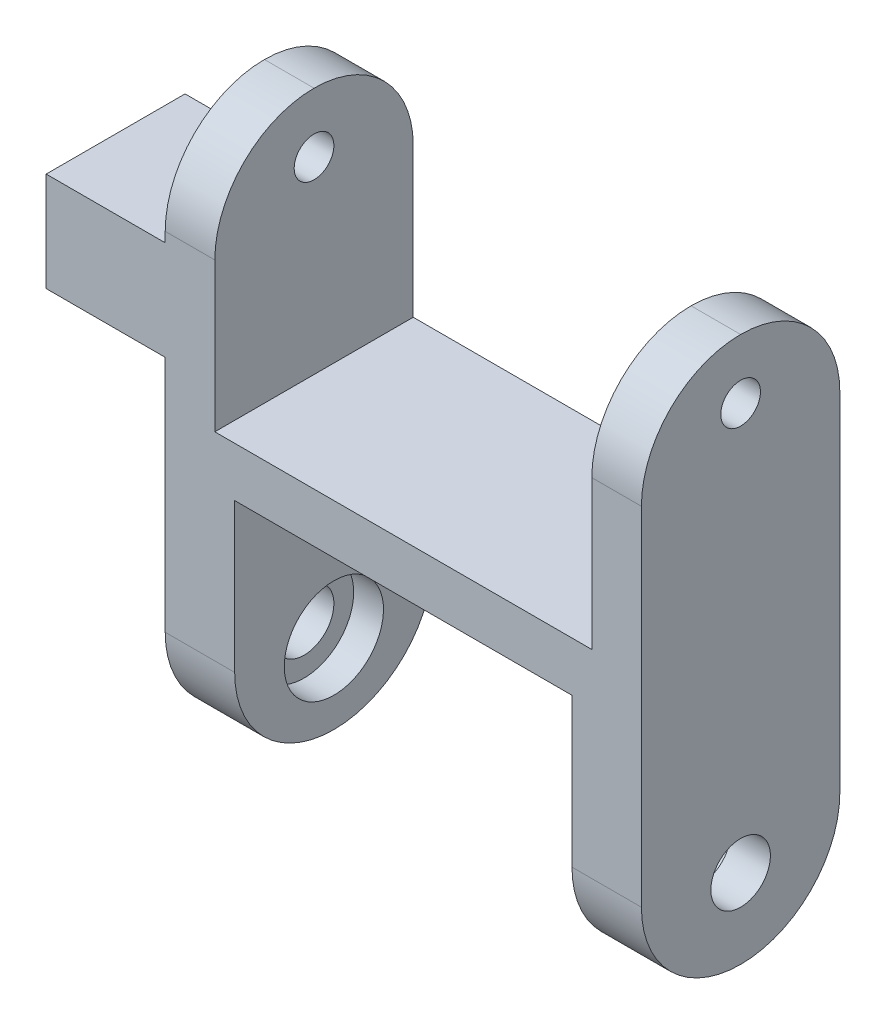
ISO-10303-21;
HEADER;
FILE_DESCRIPTION(('STEP AP214'),'2;1');
FILE_NAME('part.step','',(''),(''),'','','');
FILE_SCHEMA(('AUTOMOTIVE_DESIGN { 1 0 10303 214 1 1 1 1 }'));
ENDSEC;
DATA;
#1=APPLICATION_CONTEXT('core data for automotive mechanical design processes');
#2=APPLICATION_PROTOCOL_DEFINITION('international standard','automotive_design',2000,#1);
#3=PRODUCT_CONTEXT('',#1,'mechanical');
#4=PRODUCT('Part','Part','',(#3));
#5=PRODUCT_RELATED_PRODUCT_CATEGORY('part','',(#4));
#6=PRODUCT_DEFINITION_FORMATION('','',#4);
#7=PRODUCT_DEFINITION_CONTEXT('part definition',#1,'design');
#8=PRODUCT_DEFINITION('design','',#6,#7);
#9=PRODUCT_DEFINITION_SHAPE('','',#8);
#10=(LENGTH_UNIT() NAMED_UNIT(*) SI_UNIT(.MILLI.,.METRE.));
#11=(NAMED_UNIT(*) PLANE_ANGLE_UNIT() SI_UNIT($,.RADIAN.));
#12=(NAMED_UNIT(*) SI_UNIT($,.STERADIAN.) SOLID_ANGLE_UNIT());
#13=UNCERTAINTY_MEASURE_WITH_UNIT(LENGTH_MEASURE(1.E-05),#10,'distance_accuracy_value','');
#14=(GEOMETRIC_REPRESENTATION_CONTEXT(3) GLOBAL_UNCERTAINTY_ASSIGNED_CONTEXT((#13)) GLOBAL_UNIT_ASSIGNED_CONTEXT((#10,
#11,#12)) REPRESENTATION_CONTEXT('',''));
#15=CARTESIAN_POINT('',(0.,0.,0.));
#16=DIRECTION('',(0.,0.,1.));
#17=DIRECTION('',(1.,0.,0.));
#18=AXIS2_PLACEMENT_3D('',#15,#16,#17);
#19=CARTESIAN_POINT('',(-8.5,0.,10.));
#20=DIRECTION('',(-1.,0.,0.));
#21=DIRECTION('',(0.,-1.,0.));
#22=AXIS2_PLACEMENT_3D('',#19,#20,#21);
#23=PLANE('',#22);
#24=CARTESIAN_POINT('',(-8.5,-8.5,5.));
#25=DIRECTION('',(1.,0.,0.));
#26=DIRECTION('',(0.,1.,0.));
#27=AXIS2_PLACEMENT_3D('',#24,#25,#26);
#28=CIRCLE('',#27,2.5);
#29=CARTESIAN_POINT('',(-8.5,-6.,5.));
#30=VERTEX_POINT('',#29);
#31=EDGE_CURVE('E259',#30,#30,#28,.T.);
#32=ORIENTED_EDGE('',*,*,#31,.F.);
#33=EDGE_LOOP('',(#32));
#34=FACE_BOUND('',#33,.T.);
#35=DIRECTION('',(0.,1.,0.));
#36=VECTOR('',#35,1.);
#37=CARTESIAN_POINT('',(-8.5,0.,10.));
#38=LINE('',#37,#36);
#39=CARTESIAN_POINT('',(-8.5,-7.5,10.));
#40=VERTEX_POINT('',#39);
#41=CARTESIAN_POINT('',(-8.5,0.,10.));
#42=VERTEX_POINT('',#41);
#43=EDGE_CURVE('E268',#40,#42,#38,.T.);
#44=ORIENTED_EDGE('',*,*,#43,.F.);
#45=CARTESIAN_POINT('',(-8.5,-7.5,5.));
#46=DIRECTION('',(-1.,0.,0.));
#47=DIRECTION('',(0.,-1.,0.));
#48=AXIS2_PLACEMENT_3D('',#45,#46,#47);
#49=CIRCLE('',#48,5.);
#50=CARTESIAN_POINT('',(-8.5,-12.5,5.));
#51=VERTEX_POINT('',#50);
#52=EDGE_CURVE('E348',#40,#51,#49,.F.);
#53=ORIENTED_EDGE('',*,*,#52,.T.);
#54=CARTESIAN_POINT('',(-8.5,-7.5,5.));
#55=DIRECTION('',(-1.,0.,0.));
#56=DIRECTION('',(0.,-1.,0.));
#57=AXIS2_PLACEMENT_3D('',#54,#55,#56);
#58=CIRCLE('',#57,5.);
#59=CARTESIAN_POINT('',(-8.5,-7.5,0.));
#60=VERTEX_POINT('',#59);
#61=EDGE_CURVE('E346',#51,#60,#58,.F.);
#62=ORIENTED_EDGE('',*,*,#61,.T.);
#63=DIRECTION('',(0.,1.,0.));
#64=VECTOR('',#63,1.);
#65=CARTESIAN_POINT('',(-8.5,0.,0.));
#66=LINE('',#65,#64);
#67=CARTESIAN_POINT('',(-8.5,0.,0.));
#68=VERTEX_POINT('',#67);
#69=EDGE_CURVE('E265',#60,#68,#66,.T.);
#70=ORIENTED_EDGE('',*,*,#69,.T.);
#71=DIRECTION('',(0.,0.,-1.));
#72=VECTOR('',#71,1.);
#73=CARTESIAN_POINT('',(-8.5,0.,10.));
#74=LINE('',#73,#72);
#75=EDGE_CURVE('E315',#42,#68,#74,.T.);
#76=ORIENTED_EDGE('',*,*,#75,.F.);
#77=EDGE_LOOP('',(#44,#53,#62,#70,#76));
#78=FACE_BOUND('',#77,.T.);
#79=ADVANCED_FACE('F33',(#34,#78),#23,.F.);
#80=CARTESIAN_POINT('',(8.5,0.,10.));
#81=DIRECTION('',(0.,1.,0.));
#82=DIRECTION('',(0.,0.,1.));
#83=AXIS2_PLACEMENT_3D('',#80,#81,#82);
#84=PLANE('',#83);
#85=DIRECTION('',(1.,0.,0.));
#86=VECTOR('',#85,1.);
#87=CARTESIAN_POINT('',(8.5,0.,0.));
#88=LINE('',#87,#86);
#89=CARTESIAN_POINT('',(8.5,0.,0.));
#90=VERTEX_POINT('',#89);
#91=EDGE_CURVE('E291',#68,#90,#88,.T.);
#92=ORIENTED_EDGE('',*,*,#91,.T.);
#93=DIRECTION('',(0.,0.,-1.));
#94=VECTOR('',#93,1.);
#95=CARTESIAN_POINT('',(8.5,0.,10.));
#96=LINE('',#95,#94);
#97=CARTESIAN_POINT('',(8.5,0.,10.));
#98=VERTEX_POINT('',#97);
#99=EDGE_CURVE('E312',#98,#90,#96,.T.);
#100=ORIENTED_EDGE('',*,*,#99,.F.);
#101=DIRECTION('',(1.,0.,0.));
#102=VECTOR('',#101,1.);
#103=CARTESIAN_POINT('',(8.5,0.,10.));
#104=LINE('',#103,#102);
#105=EDGE_CURVE('E270',#42,#98,#104,.T.);
#106=ORIENTED_EDGE('',*,*,#105,.F.);
#107=ORIENTED_EDGE('',*,*,#75,.T.);
#108=EDGE_LOOP('',(#92,#100,#106,#107));
#109=FACE_BOUND('',#108,.T.);
#110=ADVANCED_FACE('F464',(#109),#84,.F.);
#111=CARTESIAN_POINT('',(8.5,0.,10.));
#112=DIRECTION('',(1.,0.,0.));
#113=DIRECTION('',(0.,1.,0.));
#114=AXIS2_PLACEMENT_3D('',#111,#112,#113);
#115=PLANE('',#114);
#116=CARTESIAN_POINT('',(8.5,-8.5,5.));
#117=DIRECTION('',(1.,0.,0.));
#118=DIRECTION('',(0.,1.,0.));
#119=AXIS2_PLACEMENT_3D('',#116,#117,#118);
#120=CIRCLE('',#119,2.5);
#121=CARTESIAN_POINT('',(8.5,-5.99999999999999,5.));
#122=VERTEX_POINT('',#121);
#123=EDGE_CURVE('E247',#122,#122,#120,.T.);
#124=ORIENTED_EDGE('',*,*,#123,.T.);
#125=EDGE_LOOP('',(#124));
#126=FACE_BOUND('',#125,.T.);
#127=CARTESIAN_POINT('',(8.5,-7.5,5.));
#128=DIRECTION('',(1.,0.,0.));
#129=DIRECTION('',(0.,1.,0.));
#130=AXIS2_PLACEMENT_3D('',#127,#128,#129);
#131=CIRCLE('',#130,5.);
#132=CARTESIAN_POINT('',(8.5,-7.5,0.));
#133=VERTEX_POINT('',#132);
#134=CARTESIAN_POINT('',(8.5,-12.5,5.));
#135=VERTEX_POINT('',#134);
#136=EDGE_CURVE('E342',#133,#135,#131,.F.);
#137=ORIENTED_EDGE('',*,*,#136,.T.);
#138=CARTESIAN_POINT('',(8.5,-7.5,5.));
#139=DIRECTION('',(1.,0.,0.));
#140=DIRECTION('',(0.,1.,0.));
#141=AXIS2_PLACEMENT_3D('',#138,#139,#140);
#142=CIRCLE('',#141,5.);
#143=CARTESIAN_POINT('',(8.5,-7.5,10.));
#144=VERTEX_POINT('',#143);
#145=EDGE_CURVE('E344',#135,#144,#142,.F.);
#146=ORIENTED_EDGE('',*,*,#145,.T.);
#147=DIRECTION('',(0.,-1.,0.));
#148=VECTOR('',#147,1.);
#149=CARTESIAN_POINT('',(8.5,0.,10.));
#150=LINE('',#149,#148);
#151=EDGE_CURVE('E273',#98,#144,#150,.T.);
#152=ORIENTED_EDGE('',*,*,#151,.F.);
#153=ORIENTED_EDGE('',*,*,#99,.T.);
#154=DIRECTION('',(0.,-1.,0.));
#155=VECTOR('',#154,1.);
#156=CARTESIAN_POINT('',(8.5,0.,0.));
#157=LINE('',#156,#155);
#158=EDGE_CURVE('E293',#90,#133,#157,.T.);
#159=ORIENTED_EDGE('',*,*,#158,.T.);
#160=EDGE_LOOP('',(#137,#146,#152,#153,#159));
#161=FACE_BOUND('',#160,.T.);
#162=ADVANCED_FACE('F470',(#126,#161),#115,.F.);
#163=CARTESIAN_POINT('',(12.,2.5,10.));
#164=DIRECTION('',(-1.,0.,0.));
#165=DIRECTION('',(0.,-1.,0.));
#166=AXIS2_PLACEMENT_3D('',#163,#164,#165);
#167=PLANE('',#166);
#168=CARTESIAN_POINT('',(12.,12.,5.));
#169=DIRECTION('',(-1.,0.,0.));
#170=DIRECTION('',(0.,0.,1.));
#171=AXIS2_PLACEMENT_3D('',#168,#169,#170);
#172=CIRCLE('',#171,1.);
#173=CARTESIAN_POINT('',(12.,12.,6.));
#174=VERTEX_POINT('',#173);
#175=EDGE_CURVE('E232',#174,#174,#172,.T.);
#176=ORIENTED_EDGE('',*,*,#175,.T.);
#177=EDGE_LOOP('',(#176));
#178=FACE_BOUND('',#177,.T.);
#179=CARTESIAN_POINT('',(12.,-8.5,5.));
#180=DIRECTION('',(1.,0.,0.));
#181=DIRECTION('',(0.,1.,0.));
#182=AXIS2_PLACEMENT_3D('',#179,#180,#181);
#183=CIRCLE('',#182,1.5);
#184=CARTESIAN_POINT('',(12.,-7.,5.));
#185=VERTEX_POINT('',#184);
#186=EDGE_CURVE('E244',#185,#185,#183,.T.);
#187=ORIENTED_EDGE('',*,*,#186,.F.);
#188=EDGE_LOOP('',(#187));
#189=FACE_BOUND('',#188,.T.);
#190=DIRECTION('',(0.,1.,0.));
#191=VECTOR('',#190,1.);
#192=CARTESIAN_POINT('',(12.,-12.5,10.));
#193=LINE('',#192,#191);
#194=CARTESIAN_POINT('',(12.,-7.5,10.));
#195=VERTEX_POINT('',#194);
#196=CARTESIAN_POINT('',(12.,10.,10.));
#197=VERTEX_POINT('',#196);
#198=EDGE_CURVE('E276',#195,#197,#193,.T.);
#199=ORIENTED_EDGE('',*,*,#198,.F.);
#200=CARTESIAN_POINT('',(12.,-7.5,5.));
#201=DIRECTION('',(-1.,0.,0.));
#202=DIRECTION('',(0.,-1.,0.));
#203=AXIS2_PLACEMENT_3D('',#200,#201,#202);
#204=CIRCLE('',#203,5.);
#205=CARTESIAN_POINT('',(12.,-12.5,5.));
#206=VERTEX_POINT('',#205);
#207=EDGE_CURVE('E340',#195,#206,#204,.F.);
#208=ORIENTED_EDGE('',*,*,#207,.T.);
#209=CARTESIAN_POINT('',(12.,-7.5,5.));
#210=DIRECTION('',(-1.,0.,0.));
#211=DIRECTION('',(0.,-1.,0.));
#212=AXIS2_PLACEMENT_3D('',#209,#210,#211);
#213=CIRCLE('',#212,5.);
#214=CARTESIAN_POINT('',(12.,-7.5,0.));
#215=VERTEX_POINT('',#214);
#216=EDGE_CURVE('E338',#206,#215,#213,.F.);
#217=ORIENTED_EDGE('',*,*,#216,.T.);
#218=DIRECTION('',(0.,1.,0.));
#219=VECTOR('',#218,1.);
#220=CARTESIAN_POINT('',(12.,2.5,0.));
#221=LINE('',#220,#219);
#222=CARTESIAN_POINT('',(12.,10.,0.));
#223=VERTEX_POINT('',#222);
#224=EDGE_CURVE('E296',#215,#223,#221,.T.);
#225=ORIENTED_EDGE('',*,*,#224,.T.);
#226=CARTESIAN_POINT('',(12.,10.,5.));
#227=DIRECTION('',(-1.,0.,0.));
#228=DIRECTION('',(0.,-1.,0.));
#229=AXIS2_PLACEMENT_3D('',#226,#227,#228);
#230=CIRCLE('',#229,5.);
#231=CARTESIAN_POINT('',(12.,15.,5.));
#232=VERTEX_POINT('',#231);
#233=EDGE_CURVE('E334',#223,#232,#230,.F.);
#234=ORIENTED_EDGE('',*,*,#233,.T.);
#235=CARTESIAN_POINT('',(12.,10.,5.));
#236=DIRECTION('',(-1.,0.,0.));
#237=DIRECTION('',(0.,-1.,0.));
#238=AXIS2_PLACEMENT_3D('',#235,#236,#237);
#239=CIRCLE('',#238,5.);
#240=EDGE_CURVE('E336',#232,#197,#239,.F.);
#241=ORIENTED_EDGE('',*,*,#240,.T.);
#242=EDGE_LOOP('',(#199,#208,#217,#225,#234,#241));
#243=FACE_BOUND('',#242,.T.);
#244=ADVANCED_FACE('F543',(#178,#189,#243),#167,.F.);
#245=CARTESIAN_POINT('',(9.5,15.,10.));
#246=DIRECTION('',(1.,0.,0.));
#247=DIRECTION('',(0.,1.,0.));
#248=AXIS2_PLACEMENT_3D('',#245,#246,#247);
#249=PLANE('',#248);
#250=CARTESIAN_POINT('',(9.5,12.,5.));
#251=DIRECTION('',(1.,0.,0.));
#252=DIRECTION('',(0.,1.,0.));
#253=AXIS2_PLACEMENT_3D('',#250,#251,#252);
#254=CIRCLE('',#253,1.);
#255=CARTESIAN_POINT('',(9.5,13.,5.));
#256=VERTEX_POINT('',#255);
#257=EDGE_CURVE('E240',#256,#256,#254,.T.);
#258=ORIENTED_EDGE('',*,*,#257,.T.);
#259=EDGE_LOOP('',(#258));
#260=FACE_BOUND('',#259,.T.);
#261=DIRECTION('',(0.,-1.,0.));
#262=VECTOR('',#261,1.);
#263=CARTESIAN_POINT('',(9.5,15.,10.));
#264=LINE('',#263,#262);
#265=CARTESIAN_POINT('',(9.5,10.,10.));
#266=VERTEX_POINT('',#265);
#267=CARTESIAN_POINT('',(9.5,2.5,10.));
#268=VERTEX_POINT('',#267);
#269=EDGE_CURVE('E279',#266,#268,#264,.T.);
#270=ORIENTED_EDGE('',*,*,#269,.F.);
#271=CARTESIAN_POINT('',(9.5,10.,5.));
#272=DIRECTION('',(1.,0.,0.));
#273=DIRECTION('',(0.,1.,0.));
#274=AXIS2_PLACEMENT_3D('',#271,#272,#273);
#275=CIRCLE('',#274,5.);
#276=CARTESIAN_POINT('',(9.5,15.,5.));
#277=VERTEX_POINT('',#276);
#278=EDGE_CURVE('E11',#266,#277,#275,.F.);
#279=ORIENTED_EDGE('',*,*,#278,.T.);
#280=CARTESIAN_POINT('',(9.5,10.,5.));
#281=DIRECTION('',(1.,0.,0.));
#282=DIRECTION('',(0.,1.,0.));
#283=AXIS2_PLACEMENT_3D('',#280,#281,#282);
#284=CIRCLE('',#283,5.);
#285=CARTESIAN_POINT('',(9.5,10.,0.));
#286=VERTEX_POINT('',#285);
#287=EDGE_CURVE('E42',#277,#286,#284,.F.);
#288=ORIENTED_EDGE('',*,*,#287,.T.);
#289=DIRECTION('',(0.,-1.,0.));
#290=VECTOR('',#289,1.);
#291=CARTESIAN_POINT('',(9.5,15.,0.));
#292=LINE('',#291,#290);
#293=CARTESIAN_POINT('',(9.5,2.5,0.));
#294=VERTEX_POINT('',#293);
#295=EDGE_CURVE('E299',#286,#294,#292,.T.);
#296=ORIENTED_EDGE('',*,*,#295,.T.);
#297=DIRECTION('',(0.,0.,-1.));
#298=VECTOR('',#297,1.);
#299=CARTESIAN_POINT('',(9.5,2.5,10.));
#300=LINE('',#299,#298);
#301=EDGE_CURVE('E309',#268,#294,#300,.T.);
#302=ORIENTED_EDGE('',*,*,#301,.F.);
#303=EDGE_LOOP('',(#270,#279,#288,#296,#302));
#304=FACE_BOUND('',#303,.T.);
#305=ADVANCED_FACE('F390',(#260,#304),#249,.F.);
#306=CARTESIAN_POINT('',(-9.5,2.5,10.));
#307=DIRECTION('',(0.,-1.,0.));
#308=DIRECTION('',(0.,0.,-1.));
#309=AXIS2_PLACEMENT_3D('',#306,#307,#308);
#310=PLANE('',#309);
#311=DIRECTION('',(-1.,0.,0.));
#312=VECTOR('',#311,1.);
#313=CARTESIAN_POINT('',(-9.5,2.5,0.));
#314=LINE('',#313,#312);
#315=CARTESIAN_POINT('',(-9.5,2.5,0.));
#316=VERTEX_POINT('',#315);
#317=EDGE_CURVE('E301',#294,#316,#314,.T.);
#318=ORIENTED_EDGE('',*,*,#317,.T.);
#319=DIRECTION('',(0.,0.,-1.));
#320=VECTOR('',#319,1.);
#321=CARTESIAN_POINT('',(-9.5,2.5,10.));
#322=LINE('',#321,#320);
#323=CARTESIAN_POINT('',(-9.5,2.5,10.));
#324=VERTEX_POINT('',#323);
#325=EDGE_CURVE('E289',#324,#316,#322,.T.);
#326=ORIENTED_EDGE('',*,*,#325,.F.);
#327=DIRECTION('',(-1.,0.,0.));
#328=VECTOR('',#327,1.);
#329=CARTESIAN_POINT('',(-9.5,2.5,10.));
#330=LINE('',#329,#328);
#331=EDGE_CURVE('E281',#268,#324,#330,.T.);
#332=ORIENTED_EDGE('',*,*,#331,.F.);
#333=ORIENTED_EDGE('',*,*,#301,.T.);
#334=EDGE_LOOP('',(#318,#326,#332,#333));
#335=FACE_BOUND('',#334,.T.);
#336=ADVANCED_FACE('F400',(#335),#310,.F.);
#337=CARTESIAN_POINT('',(-9.5,15.,10.));
#338=DIRECTION('',(-1.,0.,0.));
#339=DIRECTION('',(0.,-1.,0.));
#340=AXIS2_PLACEMENT_3D('',#337,#338,#339);
#341=PLANE('',#340);
#342=CARTESIAN_POINT('',(-9.5,12.,5.));
#343=DIRECTION('',(-1.,0.,0.));
#344=DIRECTION('',(0.,-1.,0.));
#345=AXIS2_PLACEMENT_3D('',#342,#343,#344);
#346=CIRCLE('',#345,1.);
#347=CARTESIAN_POINT('',(-9.5,11.,5.));
#348=VERTEX_POINT('',#347);
#349=EDGE_CURVE('E235',#348,#348,#346,.T.);
#350=ORIENTED_EDGE('',*,*,#349,.T.);
#351=EDGE_LOOP('',(#350));
#352=FACE_BOUND('',#351,.T.);
#353=CARTESIAN_POINT('',(-9.5,10.,5.));
#354=DIRECTION('',(-1.,0.,0.));
#355=DIRECTION('',(0.,-1.,0.));
#356=AXIS2_PLACEMENT_3D('',#353,#354,#355);
#357=CIRCLE('',#356,5.);
#358=CARTESIAN_POINT('',(-9.5,10.,0.));
#359=VERTEX_POINT('',#358);
#360=CARTESIAN_POINT('',(-9.5,15.,5.));
#361=VERTEX_POINT('',#360);
#362=EDGE_CURVE('E56',#359,#361,#357,.F.);
#363=ORIENTED_EDGE('',*,*,#362,.T.);
#364=CARTESIAN_POINT('',(-9.5,10.,5.));
#365=DIRECTION('',(-1.,0.,0.));
#366=DIRECTION('',(0.,-1.,0.));
#367=AXIS2_PLACEMENT_3D('',#364,#365,#366);
#368=CIRCLE('',#367,5.);
#369=CARTESIAN_POINT('',(-9.5,10.,10.));
#370=VERTEX_POINT('',#369);
#371=EDGE_CURVE('E367',#361,#370,#368,.F.);
#372=ORIENTED_EDGE('',*,*,#371,.T.);
#373=DIRECTION('',(0.,1.,0.));
#374=VECTOR('',#373,1.);
#375=CARTESIAN_POINT('',(-9.5,15.,10.));
#376=LINE('',#375,#374);
#377=EDGE_CURVE('E283',#324,#370,#376,.T.);
#378=ORIENTED_EDGE('',*,*,#377,.F.);
#379=ORIENTED_EDGE('',*,*,#325,.T.);
#380=DIRECTION('',(0.,1.,0.));
#381=VECTOR('',#380,1.);
#382=CARTESIAN_POINT('',(-9.5,15.,0.));
#383=LINE('',#382,#381);
#384=EDGE_CURVE('E303',#316,#359,#383,.T.);
#385=ORIENTED_EDGE('',*,*,#384,.T.);
#386=EDGE_LOOP('',(#363,#372,#378,#379,#385));
#387=FACE_BOUND('',#386,.T.);
#388=ADVANCED_FACE('F403',(#352,#387),#341,.F.);
#389=CARTESIAN_POINT('',(-12.,-12.5,10.));
#390=DIRECTION('',(1.,0.,0.));
#391=DIRECTION('',(0.,0.,-1.));
#392=AXIS2_PLACEMENT_3D('',#389,#390,#391);
#393=PLANE('',#392);
#394=CARTESIAN_POINT('',(-12.,-7.5,5.));
#395=DIRECTION('',(1.,0.,0.));
#396=DIRECTION('',(0.,0.,-1.));
#397=AXIS2_PLACEMENT_3D('',#394,#395,#396);
#398=CIRCLE('',#397,5.);
#399=CARTESIAN_POINT('',(-12.,-7.5,0.));
#400=VERTEX_POINT('',#399);
#401=CARTESIAN_POINT('',(-12.,-12.5,5.));
#402=VERTEX_POINT('',#401);
#403=EDGE_CURVE('E354',#400,#402,#398,.F.);
#404=ORIENTED_EDGE('',*,*,#403,.T.);
#405=CARTESIAN_POINT('',(-12.,-7.5,5.));
#406=DIRECTION('',(1.,0.,0.));
#407=DIRECTION('',(0.,0.,-1.));
#408=AXIS2_PLACEMENT_3D('',#405,#406,#407);
#409=CIRCLE('',#408,5.);
#410=CARTESIAN_POINT('',(-12.,-7.5,10.));
#411=VERTEX_POINT('',#410);
#412=EDGE_CURVE('E356',#402,#411,#409,.F.);
#413=ORIENTED_EDGE('',*,*,#412,.T.);
#414=DIRECTION('',(0.,-1.,0.));
#415=VECTOR('',#414,1.);
#416=CARTESIAN_POINT('',(-12.,2.5,10.));
#417=LINE('',#416,#415);
#418=CARTESIAN_POINT('',(-12.,4.5,10.));
#419=VERTEX_POINT('',#418);
#420=EDGE_CURVE('E286',#419,#411,#417,.T.);
#421=ORIENTED_EDGE('',*,*,#420,.F.);
#422=DIRECTION('',(0.,0.,1.));
#423=VECTOR('',#422,1.);
#424=CARTESIAN_POINT('',(-12.,4.5,3.));
#425=LINE('',#424,#423);
#426=CARTESIAN_POINT('',(-12.,4.5,6.));
#427=VERTEX_POINT('',#426);
#428=EDGE_CURVE('E192',#427,#419,#425,.T.);
#429=ORIENTED_EDGE('',*,*,#428,.F.);
#430=DIRECTION('',(0.,-1.,0.));
#431=VECTOR('',#430,1.);
#432=CARTESIAN_POINT('',(-12.,9.5,6.));
#433=LINE('',#432,#431);
#434=CARTESIAN_POINT('',(-12.,9.5,6.));
#435=VERTEX_POINT('',#434);
#436=EDGE_CURVE('E183',#435,#427,#433,.T.);
#437=ORIENTED_EDGE('',*,*,#436,.F.);
#438=DIRECTION('',(0.,0.,-1.));
#439=VECTOR('',#438,1.);
#440=CARTESIAN_POINT('',(-12.,9.5,3.));
#441=LINE('',#440,#439);
#442=CARTESIAN_POINT('',(-12.,9.5,10.));
#443=VERTEX_POINT('',#442);
#444=EDGE_CURVE('E189',#443,#435,#441,.T.);
#445=ORIENTED_EDGE('',*,*,#444,.F.);
#446=CARTESIAN_POINT('',(-12.,10.,10.));
#447=VERTEX_POINT('',#446);
#448=EDGE_CURVE('E287',#447,#443,#417,.T.);
#449=ORIENTED_EDGE('',*,*,#448,.F.);
#450=CARTESIAN_POINT('',(-12.,10.,5.));
#451=DIRECTION('',(1.,0.,0.));
#452=DIRECTION('',(0.,0.,-1.));
#453=AXIS2_PLACEMENT_3D('',#450,#451,#452);
#454=CIRCLE('',#453,5.);
#455=CARTESIAN_POINT('',(-12.,15.,5.));
#456=VERTEX_POINT('',#455);
#457=EDGE_CURVE('E352',#447,#456,#454,.F.);
#458=ORIENTED_EDGE('',*,*,#457,.T.);
#459=CARTESIAN_POINT('',(-12.,10.,5.));
#460=DIRECTION('',(1.,0.,0.));
#461=DIRECTION('',(0.,0.,-1.));
#462=AXIS2_PLACEMENT_3D('',#459,#460,#461);
#463=CIRCLE('',#462,5.);
#464=CARTESIAN_POINT('',(-12.,10.,0.));
#465=VERTEX_POINT('',#464);
#466=EDGE_CURVE('E350',#456,#465,#463,.F.);
#467=ORIENTED_EDGE('',*,*,#466,.T.);
#468=DIRECTION('',(0.,-1.,0.));
#469=VECTOR('',#468,1.);
#470=CARTESIAN_POINT('',(-12.,-12.5,0.));
#471=LINE('',#470,#469);
#472=EDGE_CURVE('E271',#465,#400,#471,.T.);
#473=ORIENTED_EDGE('',*,*,#472,.T.);
#474=EDGE_LOOP('',(#404,#413,#421,#429,#437,#445,#449,#458,#467,#473));
#475=FACE_BOUND('',#474,.T.);
#476=CARTESIAN_POINT('',(-12.,12.,5.));
#477=DIRECTION('',(-1.,0.,0.));
#478=DIRECTION('',(0.,0.,1.));
#479=AXIS2_PLACEMENT_3D('',#476,#477,#478);
#480=CIRCLE('',#479,1.);
#481=CARTESIAN_POINT('',(-12.,12.,6.));
#482=VERTEX_POINT('',#481);
#483=EDGE_CURVE('E231',#482,#482,#480,.T.);
#484=ORIENTED_EDGE('',*,*,#483,.F.);
#485=EDGE_LOOP('',(#484));
#486=FACE_BOUND('',#485,.T.);
#487=CARTESIAN_POINT('',(-12.,-8.5,5.));
#488=DIRECTION('',(1.,0.,0.));
#489=DIRECTION('',(0.,1.,0.));
#490=AXIS2_PLACEMENT_3D('',#487,#488,#489);
#491=CIRCLE('',#490,1.5);
#492=CARTESIAN_POINT('',(-12.,-7.,5.));
#493=VERTEX_POINT('',#492);
#494=EDGE_CURVE('E256',#493,#493,#491,.T.);
#495=ORIENTED_EDGE('',*,*,#494,.T.);
#496=EDGE_LOOP('',(#495));
#497=FACE_BOUND('',#496,.T.);
#498=ADVANCED_FACE('F185',(#475,#486,#497),#393,.F.);
#499=CARTESIAN_POINT('',(0.,0.,10.));
#500=DIRECTION('',(0.,0.,-1.));
#501=DIRECTION('',(-1.,0.,0.));
#502=AXIS2_PLACEMENT_3D('',#499,#500,#501);
#503=PLANE('',#502);
#504=ORIENTED_EDGE('',*,*,#151,.T.);
#505=DIRECTION('',(1.,0.,0.));
#506=VECTOR('',#505,1.);
#507=CARTESIAN_POINT('',(0.,-7.5,10.));
#508=LINE('',#507,#506);
#509=EDGE_CURVE('E331',#144,#195,#508,.T.);
#510=ORIENTED_EDGE('',*,*,#509,.T.);
#511=ORIENTED_EDGE('',*,*,#198,.T.);
#512=DIRECTION('',(-1.,0.,0.));
#513=VECTOR('',#512,1.);
#514=CARTESIAN_POINT('',(0.,9.99999999999998,10.));
#515=LINE('',#514,#513);
#516=EDGE_CURVE('E318',#197,#266,#515,.T.);
#517=ORIENTED_EDGE('',*,*,#516,.T.);
#518=ORIENTED_EDGE('',*,*,#269,.T.);
#519=ORIENTED_EDGE('',*,*,#331,.T.);
#520=ORIENTED_EDGE('',*,*,#377,.T.);
#521=DIRECTION('',(-1.,0.,0.));
#522=VECTOR('',#521,1.);
#523=CARTESIAN_POINT('',(0.,10.,10.));
#524=LINE('',#523,#522);
#525=EDGE_CURVE('E325',#370,#447,#524,.T.);
#526=ORIENTED_EDGE('',*,*,#525,.T.);
#527=ORIENTED_EDGE('',*,*,#448,.T.);
#528=DIRECTION('',(1.,0.,0.));
#529=VECTOR('',#528,1.);
#530=CARTESIAN_POINT('',(-18.,9.5,10.));
#531=LINE('',#530,#529);
#532=CARTESIAN_POINT('',(-18.,9.5,10.));
#533=VERTEX_POINT('',#532);
#534=EDGE_CURVE('E210',#533,#443,#531,.T.);
#535=ORIENTED_EDGE('',*,*,#534,.F.);
#536=DIRECTION('',(0.,1.,0.));
#537=VECTOR('',#536,1.);
#538=CARTESIAN_POINT('',(-18.,9.5,10.));
#539=LINE('',#538,#537);
#540=CARTESIAN_POINT('',(-18.,4.5,10.));
#541=VERTEX_POINT('',#540);
#542=EDGE_CURVE('E427',#541,#533,#539,.T.);
#543=ORIENTED_EDGE('',*,*,#542,.F.);
#544=DIRECTION('',(1.,0.,0.));
#545=VECTOR('',#544,1.);
#546=CARTESIAN_POINT('',(-18.,4.5,10.));
#547=LINE('',#546,#545);
#548=EDGE_CURVE('E225',#541,#419,#547,.T.);
#549=ORIENTED_EDGE('',*,*,#548,.T.);
#550=ORIENTED_EDGE('',*,*,#420,.T.);
#551=DIRECTION('',(1.,0.,0.));
#552=VECTOR('',#551,1.);
#553=CARTESIAN_POINT('',(0.,-7.5,10.));
#554=LINE('',#553,#552);
#555=EDGE_CURVE('E328',#411,#40,#554,.T.);
#556=ORIENTED_EDGE('',*,*,#555,.T.);
#557=ORIENTED_EDGE('',*,*,#43,.T.);
#558=ORIENTED_EDGE('',*,*,#105,.T.);
#559=EDGE_LOOP('',(#504,#510,#511,#517,#518,#519,#520,#526,#527,#535,#543,#549,#550,#556,#557,#558));
#560=FACE_BOUND('',#559,.T.);
#561=ADVANCED_FACE('F406',(#560),#503,.F.);
#562=CARTESIAN_POINT('',(0.,0.,0.));
#563=DIRECTION('',(0.,0.,-1.));
#564=DIRECTION('',(-1.,0.,0.));
#565=AXIS2_PLACEMENT_3D('',#562,#563,#564);
#566=PLANE('',#565);
#567=ORIENTED_EDGE('',*,*,#69,.F.);
#568=DIRECTION('',(1.,0.,0.));
#569=VECTOR('',#568,1.);
#570=CARTESIAN_POINT('',(-12.,-7.5,0.));
#571=LINE('',#570,#569);
#572=EDGE_CURVE('E364',#60,#400,#571,.F.);
#573=ORIENTED_EDGE('',*,*,#572,.T.);
#574=ORIENTED_EDGE('',*,*,#472,.F.);
#575=DIRECTION('',(-1.,0.,0.));
#576=VECTOR('',#575,1.);
#577=CARTESIAN_POINT('',(-9.5,10.,0.));
#578=LINE('',#577,#576);
#579=EDGE_CURVE('E360',#465,#359,#578,.F.);
#580=ORIENTED_EDGE('',*,*,#579,.T.);
#581=ORIENTED_EDGE('',*,*,#384,.F.);
#582=ORIENTED_EDGE('',*,*,#317,.F.);
#583=ORIENTED_EDGE('',*,*,#295,.F.);
#584=DIRECTION('',(-1.,0.,0.));
#585=VECTOR('',#584,1.);
#586=CARTESIAN_POINT('',(12.,10.,0.));
#587=LINE('',#586,#585);
#588=EDGE_CURVE('E358',#286,#223,#587,.F.);
#589=ORIENTED_EDGE('',*,*,#588,.T.);
#590=ORIENTED_EDGE('',*,*,#224,.F.);
#591=DIRECTION('',(1.,0.,0.));
#592=VECTOR('',#591,1.);
#593=CARTESIAN_POINT('',(8.5,-7.5,0.));
#594=LINE('',#593,#592);
#595=EDGE_CURVE('E362',#215,#133,#594,.F.);
#596=ORIENTED_EDGE('',*,*,#595,.T.);
#597=ORIENTED_EDGE('',*,*,#158,.F.);
#598=ORIENTED_EDGE('',*,*,#91,.F.);
#599=EDGE_LOOP('',(#567,#573,#574,#580,#581,#582,#583,#589,#590,#596,#597,#598));
#600=FACE_BOUND('',#599,.T.);
#601=ADVANCED_FACE('F395',(#600),#566,.T.);
#602=CARTESIAN_POINT('',(-10.,-8.5,5.));
#603=DIRECTION('',(1.,0.,0.));
#604=DIRECTION('',(0.,1.,0.));
#605=AXIS2_PLACEMENT_3D('',#602,#603,#604);
#606=CYLINDRICAL_SURFACE('',#605,2.5);
#607=CARTESIAN_POINT('',(-10.,-8.5,5.));
#608=DIRECTION('',(1.,0.,0.));
#609=DIRECTION('',(0.,1.,0.));
#610=AXIS2_PLACEMENT_3D('',#607,#608,#609);
#611=CIRCLE('',#610,2.5);
#612=CARTESIAN_POINT('',(-10.,-6.,5.));
#613=VERTEX_POINT('',#612);
#614=EDGE_CURVE('E262',#613,#613,#611,.T.);
#615=ORIENTED_EDGE('',*,*,#614,.F.);
#616=EDGE_LOOP('',(#615));
#617=FACE_BOUND('',#616,.T.);
#618=ORIENTED_EDGE('',*,*,#31,.T.);
#619=EDGE_LOOP('',(#618));
#620=FACE_BOUND('',#619,.T.);
#621=ADVANCED_FACE('F602',(#617,#620),#606,.F.);
#622=CARTESIAN_POINT('',(-10.,-8.5,5.));
#623=DIRECTION('',(1.,0.,0.));
#624=DIRECTION('',(0.,1.,0.));
#625=AXIS2_PLACEMENT_3D('',#622,#623,#624);
#626=PLANE('',#625);
#627=CARTESIAN_POINT('',(-10.,-8.5,5.));
#628=DIRECTION('',(1.,0.,0.));
#629=DIRECTION('',(0.,1.,0.));
#630=AXIS2_PLACEMENT_3D('',#627,#628,#629);
#631=CIRCLE('',#630,1.5);
#632=CARTESIAN_POINT('',(-10.,-7.,5.));
#633=VERTEX_POINT('',#632);
#634=EDGE_CURVE('E253',#633,#633,#631,.T.);
#635=ORIENTED_EDGE('',*,*,#634,.F.);
#636=EDGE_LOOP('',(#635));
#637=FACE_BOUND('',#636,.T.);
#638=ORIENTED_EDGE('',*,*,#614,.T.);
#639=EDGE_LOOP('',(#638));
#640=FACE_BOUND('',#639,.T.);
#641=ADVANCED_FACE('F612',(#637,#640),#626,.T.);
#642=CARTESIAN_POINT('',(-12.,-8.5,5.));
#643=DIRECTION('',(1.,0.,0.));
#644=DIRECTION('',(0.,1.,0.));
#645=AXIS2_PLACEMENT_3D('',#642,#643,#644);
#646=CYLINDRICAL_SURFACE('',#645,1.5);
#647=ORIENTED_EDGE('',*,*,#494,.F.);
#648=EDGE_LOOP('',(#647));
#649=FACE_BOUND('',#648,.T.);
#650=ORIENTED_EDGE('',*,*,#634,.T.);
#651=EDGE_LOOP('',(#650));
#652=FACE_BOUND('',#651,.T.);
#653=ADVANCED_FACE('F620',(#649,#652),#646,.F.);
#654=CARTESIAN_POINT('',(10.,-8.5,5.));
#655=DIRECTION('',(-1.,0.,0.));
#656=DIRECTION('',(0.,-1.,0.));
#657=AXIS2_PLACEMENT_3D('',#654,#655,#656);
#658=CYLINDRICAL_SURFACE('',#657,2.5);
#659=CARTESIAN_POINT('',(10.,-8.5,5.));
#660=DIRECTION('',(1.,0.,0.));
#661=DIRECTION('',(0.,1.,0.));
#662=AXIS2_PLACEMENT_3D('',#659,#660,#661);
#663=CIRCLE('',#662,2.5);
#664=CARTESIAN_POINT('',(10.,-5.99999999999999,5.));
#665=VERTEX_POINT('',#664);
#666=EDGE_CURVE('E250',#665,#665,#663,.T.);
#667=ORIENTED_EDGE('',*,*,#666,.T.);
#668=EDGE_LOOP('',(#667));
#669=FACE_BOUND('',#668,.T.);
#670=ORIENTED_EDGE('',*,*,#123,.F.);
#671=EDGE_LOOP('',(#670));
#672=FACE_BOUND('',#671,.T.);
#673=ADVANCED_FACE('F628',(#669,#672),#658,.F.);
#674=CARTESIAN_POINT('',(10.,-8.5,5.));
#675=DIRECTION('',(-1.,0.,0.));
#676=DIRECTION('',(0.,1.,0.));
#677=AXIS2_PLACEMENT_3D('',#674,#675,#676);
#678=PLANE('',#677);
#679=CARTESIAN_POINT('',(10.,-8.5,5.));
#680=DIRECTION('',(1.,0.,0.));
#681=DIRECTION('',(0.,1.,0.));
#682=AXIS2_PLACEMENT_3D('',#679,#680,#681);
#683=CIRCLE('',#682,1.5);
#684=CARTESIAN_POINT('',(10.,-7.,5.));
#685=VERTEX_POINT('',#684);
#686=EDGE_CURVE('E243',#685,#685,#683,.T.);
#687=ORIENTED_EDGE('',*,*,#686,.T.);
#688=EDGE_LOOP('',(#687));
#689=FACE_BOUND('',#688,.T.);
#690=ORIENTED_EDGE('',*,*,#666,.F.);
#691=EDGE_LOOP('',(#690));
#692=FACE_BOUND('',#691,.T.);
#693=ADVANCED_FACE('F636',(#689,#692),#678,.T.);
#694=CARTESIAN_POINT('',(12.,-8.5,5.));
#695=DIRECTION('',(-1.,0.,0.));
#696=DIRECTION('',(0.,-1.,0.));
#697=AXIS2_PLACEMENT_3D('',#694,#695,#696);
#698=CYLINDRICAL_SURFACE('',#697,1.5);
#699=ORIENTED_EDGE('',*,*,#186,.T.);
#700=EDGE_LOOP('',(#699));
#701=FACE_BOUND('',#700,.T.);
#702=ORIENTED_EDGE('',*,*,#686,.F.);
#703=EDGE_LOOP('',(#702));
#704=FACE_BOUND('',#703,.T.);
#705=ADVANCED_FACE('F644',(#701,#704),#698,.F.);
#706=CARTESIAN_POINT('',(12.,12.,5.));
#707=DIRECTION('',(-1.,0.,0.));
#708=DIRECTION('',(0.,0.,1.));
#709=AXIS2_PLACEMENT_3D('',#706,#707,#708);
#710=CYLINDRICAL_SURFACE('',#709,1.);
#711=ORIENTED_EDGE('',*,*,#483,.T.);
#712=EDGE_LOOP('',(#711));
#713=FACE_BOUND('',#712,.T.);
#714=ORIENTED_EDGE('',*,*,#349,.F.);
#715=EDGE_LOOP('',(#714));
#716=FACE_BOUND('',#715,.T.);
#717=ADVANCED_FACE('F652',(#713,#716),#710,.F.);
#718=ORIENTED_EDGE('',*,*,#175,.F.);
#719=EDGE_LOOP('',(#718));
#720=FACE_BOUND('',#719,.T.);
#721=ORIENTED_EDGE('',*,*,#257,.F.);
#722=EDGE_LOOP('',(#721));
#723=FACE_BOUND('',#722,.T.);
#724=ADVANCED_FACE('F660',(#720,#723),#710,.F.);
#725=CARTESIAN_POINT('',(-18.,0.,0.));
#726=DIRECTION('',(-1.,0.,0.));
#727=DIRECTION('',(0.,0.,1.));
#728=AXIS2_PLACEMENT_3D('',#725,#726,#727);
#729=PLANE('',#728);
#730=DIRECTION('',(0.,-1.,0.));
#731=VECTOR('',#730,1.);
#732=CARTESIAN_POINT('',(-18.,9.5,3.));
#733=LINE('',#732,#731);
#734=CARTESIAN_POINT('',(-18.,9.5,3.));
#735=VERTEX_POINT('',#734);
#736=CARTESIAN_POINT('',(-18.,4.5,3.));
#737=VERTEX_POINT('',#736);
#738=EDGE_CURVE('E211',#735,#737,#733,.T.);
#739=ORIENTED_EDGE('',*,*,#738,.T.);
#740=DIRECTION('',(0.,0.,1.));
#741=VECTOR('',#740,1.);
#742=CARTESIAN_POINT('',(-18.,4.5,3.));
#743=LINE('',#742,#741);
#744=EDGE_CURVE('E214',#737,#541,#743,.T.);
#745=ORIENTED_EDGE('',*,*,#744,.T.);
#746=ORIENTED_EDGE('',*,*,#542,.T.);
#747=DIRECTION('',(0.,0.,-1.));
#748=VECTOR('',#747,1.);
#749=CARTESIAN_POINT('',(-18.,9.5,3.));
#750=LINE('',#749,#748);
#751=EDGE_CURVE('E223',#533,#735,#750,.T.);
#752=ORIENTED_EDGE('',*,*,#751,.T.);
#753=EDGE_LOOP('',(#739,#745,#746,#752));
#754=FACE_BOUND('',#753,.T.);
#755=CARTESIAN_POINT('',(-18.,7.,5.));
#756=DIRECTION('',(-1.,0.,0.));
#757=DIRECTION('',(0.,0.,1.));
#758=AXIS2_PLACEMENT_3D('',#755,#756,#757);
#759=CIRCLE('',#758,0.5);
#760=CARTESIAN_POINT('',(-18.,7.,5.5));
#761=VERTEX_POINT('',#760);
#762=EDGE_CURVE('E216',#761,#761,#759,.T.);
#763=ORIENTED_EDGE('',*,*,#762,.F.);
#764=EDGE_LOOP('',(#763));
#765=FACE_BOUND('',#764,.T.);
#766=ADVANCED_FACE('F443',(#754,#765),#729,.T.);
#767=CARTESIAN_POINT('',(-18.,9.5,3.));
#768=DIRECTION('',(0.,0.,1.));
#769=DIRECTION('',(0.,-1.,0.));
#770=AXIS2_PLACEMENT_3D('',#767,#768,#769);
#771=PLANE('',#770);
#772=DIRECTION('',(1.,0.,0.));
#773=VECTOR('',#772,1.);
#774=CARTESIAN_POINT('',(-18.,9.5,3.));
#775=LINE('',#774,#773);
#776=CARTESIAN_POINT('',(-15.,9.5,3.));
#777=VERTEX_POINT('',#776);
#778=EDGE_CURVE('E220',#735,#777,#775,.T.);
#779=ORIENTED_EDGE('',*,*,#778,.T.);
#780=DIRECTION('',(0.,-1.,0.));
#781=VECTOR('',#780,1.);
#782=CARTESIAN_POINT('',(-15.,9.5,3.));
#783=LINE('',#782,#781);
#784=CARTESIAN_POINT('',(-15.,4.5,3.));
#785=VERTEX_POINT('',#784);
#786=EDGE_CURVE('E322',#777,#785,#783,.T.);
#787=ORIENTED_EDGE('',*,*,#786,.T.);
#788=DIRECTION('',(1.,0.,0.));
#789=VECTOR('',#788,1.);
#790=CARTESIAN_POINT('',(-18.,4.5,3.));
#791=LINE('',#790,#789);
#792=EDGE_CURVE('E228',#737,#785,#791,.T.);
#793=ORIENTED_EDGE('',*,*,#792,.F.);
#794=ORIENTED_EDGE('',*,*,#738,.F.);
#795=EDGE_LOOP('',(#779,#787,#793,#794));
#796=FACE_BOUND('',#795,.T.);
#797=ADVANCED_FACE('F448',(#796),#771,.F.);
#798=CARTESIAN_POINT('',(-18.,4.5,3.));
#799=DIRECTION('',(0.,1.,0.));
#800=DIRECTION('',(0.,0.,1.));
#801=AXIS2_PLACEMENT_3D('',#798,#799,#800);
#802=PLANE('',#801);
#803=ORIENTED_EDGE('',*,*,#792,.T.);
#804=DIRECTION('',(0.,0.,-1.));
#805=VECTOR('',#804,1.);
#806=CARTESIAN_POINT('',(-15.,4.5,3.));
#807=LINE('',#806,#805);
#808=CARTESIAN_POINT('',(-15.,4.5,6.));
#809=VERTEX_POINT('',#808);
#810=EDGE_CURVE('E205',#809,#785,#807,.T.);
#811=ORIENTED_EDGE('',*,*,#810,.F.);
#812=DIRECTION('',(-1.,0.,0.));
#813=VECTOR('',#812,1.);
#814=CARTESIAN_POINT('',(-12.,4.5,6.));
#815=LINE('',#814,#813);
#816=EDGE_CURVE('E373',#427,#809,#815,.T.);
#817=ORIENTED_EDGE('',*,*,#816,.F.);
#818=ORIENTED_EDGE('',*,*,#428,.T.);
#819=ORIENTED_EDGE('',*,*,#548,.F.);
#820=ORIENTED_EDGE('',*,*,#744,.F.);
#821=EDGE_LOOP('',(#803,#811,#817,#818,#819,#820));
#822=FACE_BOUND('',#821,.T.);
#823=ADVANCED_FACE('F429',(#822),#802,.F.);
#824=CARTESIAN_POINT('',(-18.,9.5,3.));
#825=DIRECTION('',(0.,-1.,0.));
#826=DIRECTION('',(0.,0.,-1.));
#827=AXIS2_PLACEMENT_3D('',#824,#825,#826);
#828=PLANE('',#827);
#829=DIRECTION('',(-1.,0.,0.));
#830=VECTOR('',#829,1.);
#831=CARTESIAN_POINT('',(-12.,9.5,6.));
#832=LINE('',#831,#830);
#833=CARTESIAN_POINT('',(-15.,9.5,6.));
#834=VERTEX_POINT('',#833);
#835=EDGE_CURVE('E201',#435,#834,#832,.T.);
#836=ORIENTED_EDGE('',*,*,#835,.T.);
#837=DIRECTION('',(0.,0.,-1.));
#838=VECTOR('',#837,1.);
#839=CARTESIAN_POINT('',(-15.,9.5,3.));
#840=LINE('',#839,#838);
#841=EDGE_CURVE('E197',#834,#777,#840,.T.);
#842=ORIENTED_EDGE('',*,*,#841,.T.);
#843=ORIENTED_EDGE('',*,*,#778,.F.);
#844=ORIENTED_EDGE('',*,*,#751,.F.);
#845=ORIENTED_EDGE('',*,*,#534,.T.);
#846=ORIENTED_EDGE('',*,*,#444,.T.);
#847=EDGE_LOOP('',(#836,#842,#843,#844,#845,#846));
#848=FACE_BOUND('',#847,.T.);
#849=ADVANCED_FACE('F207',(#848),#828,.F.);
#850=CARTESIAN_POINT('',(-18.,7.,5.));
#851=DIRECTION('',(1.,0.,0.));
#852=DIRECTION('',(0.,0.,-1.));
#853=AXIS2_PLACEMENT_3D('',#850,#851,#852);
#854=CYLINDRICAL_SURFACE('',#853,0.5);
#855=CARTESIAN_POINT('',(-15.,7.,5.));
#856=DIRECTION('',(-1.,0.,0.));
#857=DIRECTION('',(0.,0.,1.));
#858=AXIS2_PLACEMENT_3D('',#855,#856,#857);
#859=CIRCLE('',#858,0.5);
#860=CARTESIAN_POINT('',(-15.,7.,5.5));
#861=VERTEX_POINT('',#860);
#862=EDGE_CURVE('E319',#861,#861,#859,.T.);
#863=ORIENTED_EDGE('',*,*,#862,.F.);
#864=EDGE_LOOP('',(#863));
#865=FACE_BOUND('',#864,.T.);
#866=ORIENTED_EDGE('',*,*,#762,.T.);
#867=EDGE_LOOP('',(#866));
#868=FACE_BOUND('',#867,.T.);
#869=ADVANCED_FACE('F452',(#865,#868),#854,.F.);
#870=CARTESIAN_POINT('',(-15.,9.5,3.));
#871=DIRECTION('',(-1.,0.,0.));
#872=DIRECTION('',(0.,0.,1.));
#873=AXIS2_PLACEMENT_3D('',#870,#871,#872);
#874=PLANE('',#873);
#875=ORIENTED_EDGE('',*,*,#862,.T.);
#876=EDGE_LOOP('',(#875));
#877=FACE_BOUND('',#876,.T.);
#878=ORIENTED_EDGE('',*,*,#810,.T.);
#879=ORIENTED_EDGE('',*,*,#786,.F.);
#880=ORIENTED_EDGE('',*,*,#841,.F.);
#881=DIRECTION('',(0.,-1.,0.));
#882=VECTOR('',#881,1.);
#883=CARTESIAN_POINT('',(-15.,9.5,6.));
#884=LINE('',#883,#882);
#885=EDGE_CURVE('E196',#834,#809,#884,.T.);
#886=ORIENTED_EDGE('',*,*,#885,.T.);
#887=EDGE_LOOP('',(#878,#879,#880,#886));
#888=FACE_BOUND('',#887,.T.);
#889=ADVANCED_FACE('F450',(#877,#888),#874,.F.);
#890=CARTESIAN_POINT('',(-12.,9.5,6.));
#891=DIRECTION('',(0.,0.,1.));
#892=DIRECTION('',(1.,0.,0.));
#893=AXIS2_PLACEMENT_3D('',#890,#891,#892);
#894=PLANE('',#893);
#895=ORIENTED_EDGE('',*,*,#816,.T.);
#896=ORIENTED_EDGE('',*,*,#885,.F.);
#897=ORIENTED_EDGE('',*,*,#835,.F.);
#898=ORIENTED_EDGE('',*,*,#436,.T.);
#899=EDGE_LOOP('',(#895,#896,#897,#898));
#900=FACE_BOUND('',#899,.T.);
#901=ADVANCED_FACE('F202',(#900),#894,.F.);
#902=CARTESIAN_POINT('',(8.5,-7.5,5.));
#903=DIRECTION('',(-1.,0.,0.));
#904=DIRECTION('',(0.,0.,1.));
#905=AXIS2_PLACEMENT_3D('',#902,#903,#904);
#906=CYLINDRICAL_SURFACE('',#905,5.);
#907=DIRECTION('',(1.,0.,0.));
#908=VECTOR('',#907,1.);
#909=CARTESIAN_POINT('',(12.,-12.5,5.));
#910=LINE('',#909,#908);
#911=EDGE_CURVE('E370',#135,#206,#910,.T.);
#912=ORIENTED_EDGE('',*,*,#911,.F.);
#913=ORIENTED_EDGE('',*,*,#136,.F.);
#914=ORIENTED_EDGE('',*,*,#595,.F.);
#915=ORIENTED_EDGE('',*,*,#216,.F.);
#916=EDGE_LOOP('',(#912,#913,#914,#915));
#917=FACE_BOUND('',#916,.T.);
#918=ADVANCED_FACE('F459',(#917),#906,.T.);
#919=CARTESIAN_POINT('',(0.,-7.5,5.));
#920=DIRECTION('',(1.,0.,0.));
#921=DIRECTION('',(0.,0.,-1.));
#922=AXIS2_PLACEMENT_3D('',#919,#920,#921);
#923=CYLINDRICAL_SURFACE('',#922,5.);
#924=ORIENTED_EDGE('',*,*,#145,.F.);
#925=ORIENTED_EDGE('',*,*,#911,.T.);
#926=ORIENTED_EDGE('',*,*,#207,.F.);
#927=ORIENTED_EDGE('',*,*,#509,.F.);
#928=EDGE_LOOP('',(#924,#925,#926,#927));
#929=FACE_BOUND('',#928,.T.);
#930=ADVANCED_FACE('F477',(#929),#923,.T.);
#931=CARTESIAN_POINT('',(-8.5,-7.5,5.));
#932=DIRECTION('',(-1.,0.,0.));
#933=DIRECTION('',(0.,-1.,0.));
#934=AXIS2_PLACEMENT_3D('',#931,#932,#933);
#935=CYLINDRICAL_SURFACE('',#934,5.);
#936=DIRECTION('',(1.,0.,0.));
#937=VECTOR('',#936,1.);
#938=CARTESIAN_POINT('',(-8.5,-12.5,5.));
#939=LINE('',#938,#937);
#940=EDGE_CURVE('E374',#402,#51,#939,.T.);
#941=ORIENTED_EDGE('',*,*,#940,.F.);
#942=ORIENTED_EDGE('',*,*,#403,.F.);
#943=ORIENTED_EDGE('',*,*,#572,.F.);
#944=ORIENTED_EDGE('',*,*,#61,.F.);
#945=EDGE_LOOP('',(#941,#942,#943,#944));
#946=FACE_BOUND('',#945,.T.);
#947=ADVANCED_FACE('F417',(#946),#935,.T.);
#948=CARTESIAN_POINT('',(0.,-7.5,5.));
#949=DIRECTION('',(1.,0.,0.));
#950=DIRECTION('',(0.,1.,0.));
#951=AXIS2_PLACEMENT_3D('',#948,#949,#950);
#952=CYLINDRICAL_SURFACE('',#951,5.);
#953=ORIENTED_EDGE('',*,*,#412,.F.);
#954=ORIENTED_EDGE('',*,*,#940,.T.);
#955=ORIENTED_EDGE('',*,*,#52,.F.);
#956=ORIENTED_EDGE('',*,*,#555,.F.);
#957=EDGE_LOOP('',(#953,#954,#955,#956));
#958=FACE_BOUND('',#957,.T.);
#959=ADVANCED_FACE('F422',(#958),#952,.T.);
#960=CARTESIAN_POINT('',(-12.,10.,5.));
#961=DIRECTION('',(1.,0.,0.));
#962=DIRECTION('',(0.,0.,-1.));
#963=AXIS2_PLACEMENT_3D('',#960,#961,#962);
#964=CYLINDRICAL_SURFACE('',#963,5.);
#965=DIRECTION('',(-1.,0.,0.));
#966=VECTOR('',#965,1.);
#967=CARTESIAN_POINT('',(-12.,15.,5.));
#968=LINE('',#967,#966);
#969=EDGE_CURVE('E376',#361,#456,#968,.T.);
#970=ORIENTED_EDGE('',*,*,#969,.F.);
#971=ORIENTED_EDGE('',*,*,#362,.F.);
#972=ORIENTED_EDGE('',*,*,#579,.F.);
#973=ORIENTED_EDGE('',*,*,#466,.F.);
#974=EDGE_LOOP('',(#970,#971,#972,#973));
#975=FACE_BOUND('',#974,.T.);
#976=ADVANCED_FACE('F412',(#975),#964,.T.);
#977=CARTESIAN_POINT('',(0.,10.,5.));
#978=DIRECTION('',(-1.,0.,0.));
#979=DIRECTION('',(0.,0.,1.));
#980=AXIS2_PLACEMENT_3D('',#977,#978,#979);
#981=CYLINDRICAL_SURFACE('',#980,5.);
#982=ORIENTED_EDGE('',*,*,#371,.F.);
#983=ORIENTED_EDGE('',*,*,#969,.T.);
#984=ORIENTED_EDGE('',*,*,#457,.F.);
#985=ORIENTED_EDGE('',*,*,#525,.F.);
#986=EDGE_LOOP('',(#982,#983,#984,#985));
#987=FACE_BOUND('',#986,.T.);
#988=ADVANCED_FACE('F407',(#987),#981,.T.);
#989=CARTESIAN_POINT('',(12.,10.,5.));
#990=DIRECTION('',(1.,0.,0.));
#991=DIRECTION('',(0.,1.,0.));
#992=AXIS2_PLACEMENT_3D('',#989,#990,#991);
#993=CYLINDRICAL_SURFACE('',#992,5.);
#994=DIRECTION('',(-1.,0.,0.));
#995=VECTOR('',#994,1.);
#996=CARTESIAN_POINT('',(9.5,15.,5.));
#997=LINE('',#996,#995);
#998=EDGE_CURVE('E37',#232,#277,#997,.T.);
#999=ORIENTED_EDGE('',*,*,#998,.F.);
#1000=ORIENTED_EDGE('',*,*,#233,.F.);
#1001=ORIENTED_EDGE('',*,*,#588,.F.);
#1002=ORIENTED_EDGE('',*,*,#287,.F.);
#1003=EDGE_LOOP('',(#999,#1000,#1001,#1002));
#1004=FACE_BOUND('',#1003,.T.);
#1005=ADVANCED_FACE('F35',(#1004),#993,.T.);
#1006=CARTESIAN_POINT('',(0.,9.99999999999998,5.));
#1007=DIRECTION('',(-1.,0.,0.));
#1008=DIRECTION('',(0.,-1.,0.));
#1009=AXIS2_PLACEMENT_3D('',#1006,#1007,#1008);
#1010=CYLINDRICAL_SURFACE('',#1009,5.);
#1011=ORIENTED_EDGE('',*,*,#240,.F.);
#1012=ORIENTED_EDGE('',*,*,#998,.T.);
#1013=ORIENTED_EDGE('',*,*,#278,.F.);
#1014=ORIENTED_EDGE('',*,*,#516,.F.);
#1015=EDGE_LOOP('',(#1011,#1012,#1013,#1014));
#1016=FACE_BOUND('',#1015,.T.);
#1017=ADVANCED_FACE('F384',(#1016),#1010,.T.);
#1018=CLOSED_SHELL('',(#79,#110,#162,#244,#305,#336,#388,#498,#561,#601,#621,#641,#653,#673,
#693,#705,#717,#724,#766,#797,#823,#849,#869,#889,#901,#918,#930,#947,#959,#976,#988,#1005,#1017));
#1019=MANIFOLD_SOLID_BREP('B2',#1018);
#1020=ADVANCED_BREP_SHAPE_REPRESENTATION('',(#18,#1019),#14);
#1021=SHAPE_DEFINITION_REPRESENTATION(#9,#1020);
ENDSEC;
END-ISO-10303-21;
